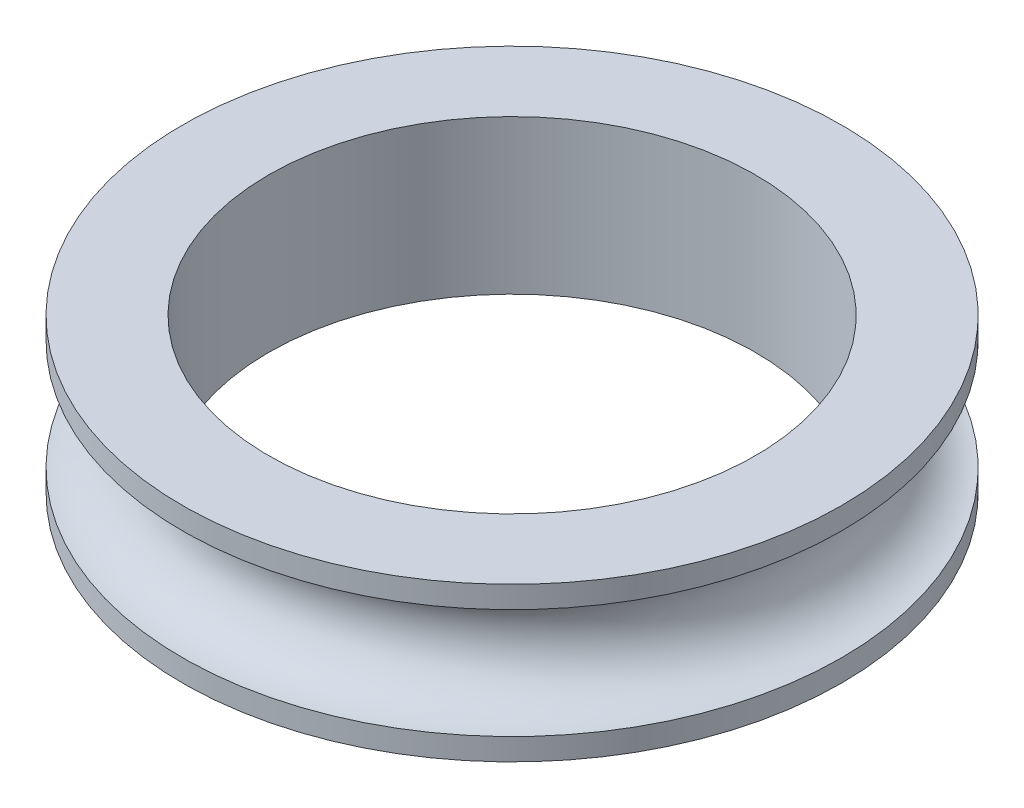
ISO-10303-21;
HEADER;
FILE_DESCRIPTION(('STEP AP214'),'2;1');
FILE_NAME('part.step','',(''),(''),'','','');
FILE_SCHEMA(('AUTOMOTIVE_DESIGN { 1 0 10303 214 1 1 1 1 }'));
ENDSEC;
DATA;
#1=APPLICATION_CONTEXT('core data for automotive mechanical design processes');
#2=APPLICATION_PROTOCOL_DEFINITION('international standard','automotive_design',2000,#1);
#3=PRODUCT_CONTEXT('',#1,'mechanical');
#4=PRODUCT('Part','Part','',(#3));
#5=PRODUCT_RELATED_PRODUCT_CATEGORY('part','',(#4));
#6=PRODUCT_DEFINITION_FORMATION('','',#4);
#7=PRODUCT_DEFINITION_CONTEXT('part definition',#1,'design');
#8=PRODUCT_DEFINITION('design','',#6,#7);
#9=PRODUCT_DEFINITION_SHAPE('','',#8);
#10=(LENGTH_UNIT() NAMED_UNIT(*) SI_UNIT(.MILLI.,.METRE.));
#11=(NAMED_UNIT(*) PLANE_ANGLE_UNIT() SI_UNIT($,.RADIAN.));
#12=(NAMED_UNIT(*) SI_UNIT($,.STERADIAN.) SOLID_ANGLE_UNIT());
#13=UNCERTAINTY_MEASURE_WITH_UNIT(LENGTH_MEASURE(1.E-05),#10,'distance_accuracy_value','');
#14=(GEOMETRIC_REPRESENTATION_CONTEXT(3) GLOBAL_UNCERTAINTY_ASSIGNED_CONTEXT((#13)) GLOBAL_UNIT_ASSIGNED_CONTEXT((#10,
#11,#12)) REPRESENTATION_CONTEXT('',''));
#15=CARTESIAN_POINT('',(0.,0.,0.));
#16=DIRECTION('',(0.,0.,1.));
#17=DIRECTION('',(1.,0.,0.));
#18=AXIS2_PLACEMENT_3D('',#15,#16,#17);
#19=CARTESIAN_POINT('',(0.,3.5,0.));
#20=DIRECTION('',(0.,-1.,0.));
#21=DIRECTION('',(1.,0.,0.));
#22=AXIS2_PLACEMENT_3D('',#19,#20,#21);
#23=PLANE('',#22);
#24=CARTESIAN_POINT('',(0.,3.5,0.));
#25=DIRECTION('',(0.,1.,0.));
#26=DIRECTION('',(-1.,0.,0.));
#27=AXIS2_PLACEMENT_3D('',#24,#25,#26);
#28=CIRCLE('',#27,11.075);
#29=CARTESIAN_POINT('',(-11.075,3.5,0.));
#30=VERTEX_POINT('',#29);
#31=EDGE_CURVE('E67',#30,#30,#28,.T.);
#32=ORIENTED_EDGE('',*,*,#31,.F.);
#33=EDGE_LOOP('',(#32));
#34=FACE_BOUND('',#33,.T.);
#35=CARTESIAN_POINT('',(0.,3.5,0.));
#36=DIRECTION('',(0.,-1.,0.));
#37=DIRECTION('',(1.,0.,0.));
#38=AXIS2_PLACEMENT_3D('',#35,#36,#37);
#39=CIRCLE('',#38,15.);
#40=CARTESIAN_POINT('',(15.,3.5,0.));
#41=VERTEX_POINT('',#40);
#42=EDGE_CURVE('E10',#41,#41,#39,.T.);
#43=ORIENTED_EDGE('',*,*,#42,.F.);
#44=EDGE_LOOP('',(#43));
#45=FACE_BOUND('',#44,.T.);
#46=ADVANCED_FACE('F43',(#34,#45),#23,.F.);
#47=CARTESIAN_POINT('',(0.,-3.5,0.));
#48=DIRECTION('',(0.,-1.,0.));
#49=DIRECTION('',(1.,0.,0.));
#50=AXIS2_PLACEMENT_3D('',#47,#48,#49);
#51=CYLINDRICAL_SURFACE('',#50,15.);
#52=CARTESIAN_POINT('',(0.,2.50000000000001,0.));
#53=DIRECTION('',(0.,-1.,0.));
#54=DIRECTION('',(1.,0.,0.));
#55=AXIS2_PLACEMENT_3D('',#52,#53,#54);
#56=CIRCLE('',#55,15.);
#57=CARTESIAN_POINT('',(15.,2.50000000000001,0.));
#58=VERTEX_POINT('',#57);
#59=EDGE_CURVE('E50',#58,#58,#56,.T.);
#60=ORIENTED_EDGE('',*,*,#59,.F.);
#61=EDGE_LOOP('',(#60));
#62=FACE_BOUND('',#61,.T.);
#63=ORIENTED_EDGE('',*,*,#42,.T.);
#64=EDGE_LOOP('',(#63));
#65=FACE_BOUND('',#64,.T.);
#66=ADVANCED_FACE('F86',(#62,#65),#51,.T.);
#67=CARTESIAN_POINT('',(0.,0.,0.));
#68=DIRECTION('',(0.,-1.,0.));
#69=DIRECTION('',(1.,0.,0.));
#70=AXIS2_PLACEMENT_3D('',#67,#68,#69);
#71=TOROIDAL_SURFACE('',#70,15.,2.50000000000001);
#72=CARTESIAN_POINT('',(0.,-2.50000000000001,0.));
#73=DIRECTION('',(0.,-1.,0.));
#74=DIRECTION('',(1.,0.,0.));
#75=AXIS2_PLACEMENT_3D('',#72,#73,#74);
#76=CIRCLE('',#75,15.);
#77=CARTESIAN_POINT('',(15.,-2.5,0.));
#78=VERTEX_POINT('',#77);
#79=EDGE_CURVE('E55',#78,#78,#76,.T.);
#80=ORIENTED_EDGE('',*,*,#79,.F.);
#81=EDGE_LOOP('',(#80));
#82=FACE_BOUND('',#81,.T.);
#83=ORIENTED_EDGE('',*,*,#59,.T.);
#84=EDGE_LOOP('',(#83));
#85=FACE_BOUND('',#84,.T.);
#86=ADVANCED_FACE('F92',(#82,#85),#71,.F.);
#87=CARTESIAN_POINT('',(0.,-3.5,0.));
#88=DIRECTION('',(0.,-1.,0.));
#89=DIRECTION('',(1.,0.,0.));
#90=AXIS2_PLACEMENT_3D('',#87,#88,#89);
#91=CYLINDRICAL_SURFACE('',#90,15.);
#92=CARTESIAN_POINT('',(0.,-3.5,0.));
#93=DIRECTION('',(0.,-1.,0.));
#94=DIRECTION('',(1.,0.,0.));
#95=AXIS2_PLACEMENT_3D('',#92,#93,#94);
#96=CIRCLE('',#95,15.);
#97=CARTESIAN_POINT('',(15.,-3.5,0.));
#98=VERTEX_POINT('',#97);
#99=EDGE_CURVE('E60',#98,#98,#96,.T.);
#100=ORIENTED_EDGE('',*,*,#99,.F.);
#101=EDGE_LOOP('',(#100));
#102=FACE_BOUND('',#101,.T.);
#103=ORIENTED_EDGE('',*,*,#79,.T.);
#104=EDGE_LOOP('',(#103));
#105=FACE_BOUND('',#104,.T.);
#106=ADVANCED_FACE('F97',(#102,#105),#91,.T.);
#107=CARTESIAN_POINT('',(0.,-3.5,0.));
#108=DIRECTION('',(0.,1.,0.));
#109=DIRECTION('',(-1.,0.,0.));
#110=AXIS2_PLACEMENT_3D('',#107,#108,#109);
#111=PLANE('',#110);
#112=CARTESIAN_POINT('',(0.,-3.5,0.));
#113=DIRECTION('',(0.,1.,0.));
#114=DIRECTION('',(-1.,0.,0.));
#115=AXIS2_PLACEMENT_3D('',#112,#113,#114);
#116=CIRCLE('',#115,11.075);
#117=CARTESIAN_POINT('',(-11.075,-3.5,0.));
#118=VERTEX_POINT('',#117);
#119=EDGE_CURVE('E66',#118,#118,#116,.T.);
#120=ORIENTED_EDGE('',*,*,#119,.T.);
#121=EDGE_LOOP('',(#120));
#122=FACE_BOUND('',#121,.T.);
#123=ORIENTED_EDGE('',*,*,#99,.T.);
#124=EDGE_LOOP('',(#123));
#125=FACE_BOUND('',#124,.T.);
#126=ADVANCED_FACE('F75',(#122,#125),#111,.F.);
#127=CARTESIAN_POINT('',(0.,-3.5,0.));
#128=DIRECTION('',(0.,1.,0.));
#129=DIRECTION('',(-1.,0.,0.));
#130=AXIS2_PLACEMENT_3D('',#127,#128,#129);
#131=CYLINDRICAL_SURFACE('',#130,11.075);
#132=ORIENTED_EDGE('',*,*,#119,.F.);
#133=EDGE_LOOP('',(#132));
#134=FACE_BOUND('',#133,.T.);
#135=ORIENTED_EDGE('',*,*,#31,.T.);
#136=EDGE_LOOP('',(#135));
#137=FACE_BOUND('',#136,.T.);
#138=ADVANCED_FACE('F78',(#134,#137),#131,.F.);
#139=CLOSED_SHELL('',(#46,#66,#86,#106,#126,#138));
#140=MANIFOLD_SOLID_BREP('B2',#139);
#141=ADVANCED_BREP_SHAPE_REPRESENTATION('',(#18,#140),#14);
#142=SHAPE_DEFINITION_REPRESENTATION(#9,#141);
ENDSEC;
END-ISO-10303-21;
